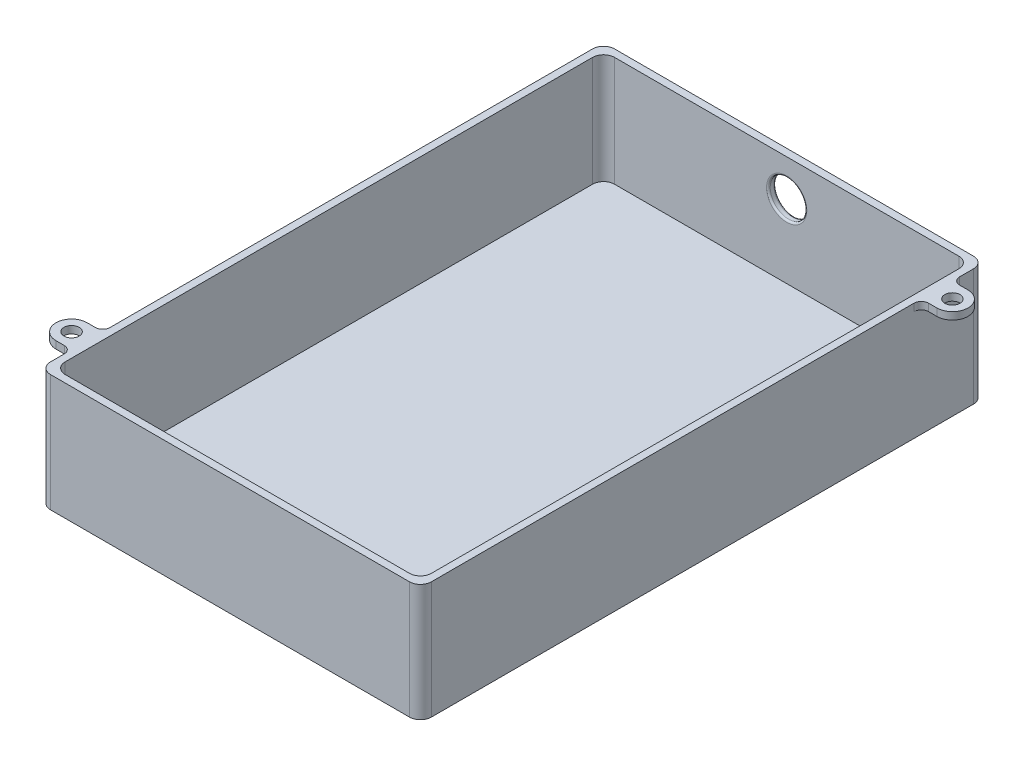
ISO-10303-21;
HEADER;
FILE_DESCRIPTION(('STEP AP214'),'2;1');
FILE_NAME('part.step','',(''),(''),'','','');
FILE_SCHEMA(('AUTOMOTIVE_DESIGN { 1 0 10303 214 1 1 1 1 }'));
ENDSEC;
DATA;
#1=APPLICATION_CONTEXT('core data for automotive mechanical design processes');
#2=APPLICATION_PROTOCOL_DEFINITION('international standard','automotive_design',2000,#1);
#3=PRODUCT_CONTEXT('',#1,'mechanical');
#4=PRODUCT('Part','Part','',(#3));
#5=PRODUCT_RELATED_PRODUCT_CATEGORY('part','',(#4));
#6=PRODUCT_DEFINITION_FORMATION('','',#4);
#7=PRODUCT_DEFINITION_CONTEXT('part definition',#1,'design');
#8=PRODUCT_DEFINITION('design','',#6,#7);
#9=PRODUCT_DEFINITION_SHAPE('','',#8);
#10=(LENGTH_UNIT() NAMED_UNIT(*) SI_UNIT(.MILLI.,.METRE.));
#11=(NAMED_UNIT(*) PLANE_ANGLE_UNIT() SI_UNIT($,.RADIAN.));
#12=(NAMED_UNIT(*) SI_UNIT($,.STERADIAN.) SOLID_ANGLE_UNIT());
#13=UNCERTAINTY_MEASURE_WITH_UNIT(LENGTH_MEASURE(1.E-05),#10,'distance_accuracy_value','');
#14=(GEOMETRIC_REPRESENTATION_CONTEXT(3) GLOBAL_UNCERTAINTY_ASSIGNED_CONTEXT((#13)) GLOBAL_UNIT_ASSIGNED_CONTEXT((#10,
#11,#12)) REPRESENTATION_CONTEXT('',''));
#15=CARTESIAN_POINT('',(0.,0.,0.));
#16=DIRECTION('',(0.,0.,1.));
#17=DIRECTION('',(1.,0.,0.));
#18=AXIS2_PLACEMENT_3D('',#15,#16,#17);
#19=CARTESIAN_POINT('',(-52.,30.,77.));
#20=DIRECTION('',(1.,0.,0.));
#21=DIRECTION('',(0.,0.,-1.));
#22=AXIS2_PLACEMENT_3D('',#19,#20,#21);
#23=PLANE('',#22);
#24=DIRECTION('',(0.,0.,1.));
#25=VECTOR('',#24,1.);
#26=CARTESIAN_POINT('',(-52.,30.,77.));
#27=LINE('',#26,#25);
#28=CARTESIAN_POINT('',(-52.,30.,70.25));
#29=VERTEX_POINT('',#28);
#30=CARTESIAN_POINT('',(-52.,30.,74.));
#31=VERTEX_POINT('',#30);
#32=EDGE_CURVE('E357',#29,#31,#27,.T.);
#33=ORIENTED_EDGE('',*,*,#32,.F.);
#34=DIRECTION('',(0.,1.,0.));
#35=VECTOR('',#34,1.);
#36=CARTESIAN_POINT('',(-52.,30.,70.25));
#37=LINE('',#36,#35);
#38=CARTESIAN_POINT('',(-52.,28.,70.25));
#39=VERTEX_POINT('',#38);
#40=EDGE_CURVE('E518',#29,#39,#37,.F.);
#41=ORIENTED_EDGE('',*,*,#40,.T.);
#42=DIRECTION('',(0.,0.,1.));
#43=VECTOR('',#42,1.);
#44=CARTESIAN_POINT('',(-52.,28.,0.));
#45=LINE('',#44,#43);
#46=CARTESIAN_POINT('',(-52.,28.,57.75));
#47=VERTEX_POINT('',#46);
#48=EDGE_CURVE('E243',#47,#39,#45,.T.);
#49=ORIENTED_EDGE('',*,*,#48,.F.);
#50=DIRECTION('',(0.,1.,0.));
#51=VECTOR('',#50,1.);
#52=CARTESIAN_POINT('',(-52.,30.,57.75));
#53=LINE('',#52,#51);
#54=CARTESIAN_POINT('',(-52.,30.,57.75));
#55=VERTEX_POINT('',#54);
#56=EDGE_CURVE('E514',#47,#55,#53,.T.);
#57=ORIENTED_EDGE('',*,*,#56,.T.);
#58=CARTESIAN_POINT('',(-52.,30.,-74.));
#59=VERTEX_POINT('',#58);
#60=EDGE_CURVE('E372',#59,#55,#27,.T.);
#61=ORIENTED_EDGE('',*,*,#60,.F.);
#62=DIRECTION('',(0.,-1.,0.));
#63=VECTOR('',#62,1.);
#64=CARTESIAN_POINT('',(-52.,30.,-74.));
#65=LINE('',#64,#63);
#66=CARTESIAN_POINT('',(-52.,-2.,-74.));
#67=VERTEX_POINT('',#66);
#68=EDGE_CURVE('E434',#59,#67,#65,.T.);
#69=ORIENTED_EDGE('',*,*,#68,.T.);
#70=DIRECTION('',(0.,0.,-1.));
#71=VECTOR('',#70,1.);
#72=CARTESIAN_POINT('',(-52.,-2.,0.));
#73=LINE('',#72,#71);
#74=CARTESIAN_POINT('',(-52.,-2.,74.));
#75=VERTEX_POINT('',#74);
#76=EDGE_CURVE('E320',#75,#67,#73,.T.);
#77=ORIENTED_EDGE('',*,*,#76,.F.);
#78=DIRECTION('',(0.,-1.,0.));
#79=VECTOR('',#78,1.);
#80=CARTESIAN_POINT('',(-52.,30.,74.));
#81=LINE('',#80,#79);
#82=EDGE_CURVE('E438',#75,#31,#81,.F.);
#83=ORIENTED_EDGE('',*,*,#82,.T.);
#84=EDGE_LOOP('',(#33,#41,#49,#57,#61,#69,#77,#83));
#85=FACE_BOUND('',#84,.T.);
#86=ADVANCED_FACE('F46',(#85),#23,.F.);
#87=CARTESIAN_POINT('',(0.,30.,0.));
#88=DIRECTION('',(0.,-1.,0.));
#89=DIRECTION('',(0.,0.,-1.));
#90=AXIS2_PLACEMENT_3D('',#87,#88,#89);
#91=PLANE('',#90);
#92=DIRECTION('',(0.,0.,-1.));
#93=VECTOR('',#92,1.);
#94=CARTESIAN_POINT('',(52.,30.,77.));
#95=LINE('',#94,#93);
#96=CARTESIAN_POINT('',(52.,30.,74.));
#97=VERTEX_POINT('',#96);
#98=CARTESIAN_POINT('',(52.,30.,-57.75));
#99=VERTEX_POINT('',#98);
#100=EDGE_CURVE('E381',#97,#99,#95,.T.);
#101=ORIENTED_EDGE('',*,*,#100,.T.);
#102=CARTESIAN_POINT('',(54.,30.,-57.75));
#103=DIRECTION('',(0.,-1.,0.));
#104=DIRECTION('',(0.,0.,-1.));
#105=AXIS2_PLACEMENT_3D('',#102,#103,#104);
#106=CIRCLE('',#105,2.);
#107=CARTESIAN_POINT('',(54.,30.,-59.75));
#108=VERTEX_POINT('',#107);
#109=EDGE_CURVE('E55',#99,#108,#106,.T.);
#110=ORIENTED_EDGE('',*,*,#109,.T.);
#111=DIRECTION('',(1.,0.,0.));
#112=VECTOR('',#111,1.);
#113=CARTESIAN_POINT('',(56.25,30.,-59.75));
#114=LINE('',#113,#112);
#115=CARTESIAN_POINT('',(56.25,30.,-59.75));
#116=VERTEX_POINT('',#115);
#117=EDGE_CURVE('E288',#108,#116,#114,.T.);
#118=ORIENTED_EDGE('',*,*,#117,.T.);
#119=CARTESIAN_POINT('',(56.25,30.,-64.));
#120=DIRECTION('',(0.,1.,0.));
#121=DIRECTION('',(0.,0.,1.));
#122=AXIS2_PLACEMENT_3D('',#119,#120,#121);
#123=CIRCLE('',#122,4.25);
#124=CARTESIAN_POINT('',(56.25,30.,-68.25));
#125=VERTEX_POINT('',#124);
#126=EDGE_CURVE('E310',#116,#125,#123,.T.);
#127=ORIENTED_EDGE('',*,*,#126,.T.);
#128=DIRECTION('',(-1.,0.,0.));
#129=VECTOR('',#128,1.);
#130=CARTESIAN_POINT('',(56.25,30.,-68.25));
#131=LINE('',#130,#129);
#132=CARTESIAN_POINT('',(54.,30.,-68.25));
#133=VERTEX_POINT('',#132);
#134=EDGE_CURVE('E296',#125,#133,#131,.T.);
#135=ORIENTED_EDGE('',*,*,#134,.T.);
#136=CARTESIAN_POINT('',(54.,30.,-70.25));
#137=DIRECTION('',(0.,-1.,0.));
#138=DIRECTION('',(0.,0.,-1.));
#139=AXIS2_PLACEMENT_3D('',#136,#137,#138);
#140=CIRCLE('',#139,2.);
#141=CARTESIAN_POINT('',(52.,30.,-70.25));
#142=VERTEX_POINT('',#141);
#143=EDGE_CURVE('E550',#133,#142,#140,.T.);
#144=ORIENTED_EDGE('',*,*,#143,.T.);
#145=CARTESIAN_POINT('',(52.,30.,-74.));
#146=VERTEX_POINT('',#145);
#147=EDGE_CURVE('E380',#142,#146,#95,.T.);
#148=ORIENTED_EDGE('',*,*,#147,.T.);
#149=CARTESIAN_POINT('',(49.,30.,-74.));
#150=DIRECTION('',(0.,-1.,0.));
#151=DIRECTION('',(0.,0.,-1.));
#152=AXIS2_PLACEMENT_3D('',#149,#150,#151);
#153=CIRCLE('',#152,3.);
#154=CARTESIAN_POINT('',(49.,30.,-77.));
#155=VERTEX_POINT('',#154);
#156=EDGE_CURVE('E424',#146,#155,#153,.F.);
#157=ORIENTED_EDGE('',*,*,#156,.T.);
#158=DIRECTION('',(-1.,0.,0.));
#159=VECTOR('',#158,1.);
#160=CARTESIAN_POINT('',(-52.,30.,-77.));
#161=LINE('',#160,#159);
#162=CARTESIAN_POINT('',(-49.,30.,-77.));
#163=VERTEX_POINT('',#162);
#164=EDGE_CURVE('E384',#155,#163,#161,.T.);
#165=ORIENTED_EDGE('',*,*,#164,.T.);
#166=CARTESIAN_POINT('',(-49.,30.,-74.));
#167=DIRECTION('',(0.,-1.,0.));
#168=DIRECTION('',(0.,0.,-1.));
#169=AXIS2_PLACEMENT_3D('',#166,#167,#168);
#170=CIRCLE('',#169,3.);
#171=EDGE_CURVE('E415',#163,#59,#170,.F.);
#172=ORIENTED_EDGE('',*,*,#171,.T.);
#173=ORIENTED_EDGE('',*,*,#60,.T.);
#174=CARTESIAN_POINT('',(-54.,30.,57.75));
#175=DIRECTION('',(0.,-1.,0.));
#176=DIRECTION('',(0.,0.,-1.));
#177=AXIS2_PLACEMENT_3D('',#174,#175,#176);
#178=CIRCLE('',#177,2.);
#179=CARTESIAN_POINT('',(-54.,30.,59.75));
#180=VERTEX_POINT('',#179);
#181=EDGE_CURVE('E544',#55,#180,#178,.T.);
#182=ORIENTED_EDGE('',*,*,#181,.T.);
#183=DIRECTION('',(1.,0.,0.));
#184=VECTOR('',#183,1.);
#185=CARTESIAN_POINT('',(0.,30.,59.7500000000001));
#186=LINE('',#185,#184);
#187=CARTESIAN_POINT('',(-56.25,30.,59.75));
#188=VERTEX_POINT('',#187);
#189=EDGE_CURVE('E272',#188,#180,#186,.T.);
#190=ORIENTED_EDGE('',*,*,#189,.F.);
#191=CARTESIAN_POINT('',(-56.25,30.,64.));
#192=DIRECTION('',(0.,1.,0.));
#193=DIRECTION('',(0.,0.,1.));
#194=AXIS2_PLACEMENT_3D('',#191,#192,#193);
#195=CIRCLE('',#194,4.25);
#196=CARTESIAN_POINT('',(-56.25,30.,68.25));
#197=VERTEX_POINT('',#196);
#198=EDGE_CURVE('E237',#188,#197,#195,.T.);
#199=ORIENTED_EDGE('',*,*,#198,.T.);
#200=DIRECTION('',(1.,0.,0.));
#201=VECTOR('',#200,1.);
#202=CARTESIAN_POINT('',(-2.22860945384315E-13,30.,68.2500000000002));
#203=LINE('',#202,#201);
#204=CARTESIAN_POINT('',(-54.,30.,68.25));
#205=VERTEX_POINT('',#204);
#206=EDGE_CURVE('E277',#197,#205,#203,.T.);
#207=ORIENTED_EDGE('',*,*,#206,.T.);
#208=CARTESIAN_POINT('',(-54.,30.,70.25));
#209=DIRECTION('',(0.,-1.,0.));
#210=DIRECTION('',(0.,0.,-1.));
#211=AXIS2_PLACEMENT_3D('',#208,#209,#210);
#212=CIRCLE('',#211,2.);
#213=EDGE_CURVE('E538',#205,#29,#212,.T.);
#214=ORIENTED_EDGE('',*,*,#213,.T.);
#215=ORIENTED_EDGE('',*,*,#32,.T.);
#216=CARTESIAN_POINT('',(-49.,30.,74.));
#217=DIRECTION('',(0.,-1.,0.));
#218=DIRECTION('',(0.,0.,-1.));
#219=AXIS2_PLACEMENT_3D('',#216,#217,#218);
#220=CIRCLE('',#219,3.);
#221=CARTESIAN_POINT('',(-49.,30.,77.));
#222=VERTEX_POINT('',#221);
#223=EDGE_CURVE('E418',#31,#222,#220,.F.);
#224=ORIENTED_EDGE('',*,*,#223,.T.);
#225=DIRECTION('',(1.,0.,0.));
#226=VECTOR('',#225,1.);
#227=CARTESIAN_POINT('',(-52.,30.,77.));
#228=LINE('',#227,#226);
#229=CARTESIAN_POINT('',(49.,30.,77.));
#230=VERTEX_POINT('',#229);
#231=EDGE_CURVE('E376',#222,#230,#228,.T.);
#232=ORIENTED_EDGE('',*,*,#231,.T.);
#233=CARTESIAN_POINT('',(49.,30.,74.));
#234=DIRECTION('',(0.,-1.,0.));
#235=DIRECTION('',(0.,0.,-1.));
#236=AXIS2_PLACEMENT_3D('',#233,#234,#235);
#237=CIRCLE('',#236,3.);
#238=EDGE_CURVE('E421',#230,#97,#237,.F.);
#239=ORIENTED_EDGE('',*,*,#238,.T.);
#240=EDGE_LOOP('',(#101,#110,#118,#127,#135,#144,#148,#157,#165,#172,#173,#182,#190,#199,#207,
#214,#215,#224,#232,#239));
#241=FACE_BOUND('',#240,.T.);
#242=DIRECTION('',(0.,0.,-1.));
#243=VECTOR('',#242,1.);
#244=CARTESIAN_POINT('',(50.,30.,75.));
#245=LINE('',#244,#243);
#246=CARTESIAN_POINT('',(50.,30.,72.));
#247=VERTEX_POINT('',#246);
#248=CARTESIAN_POINT('',(50.,30.,-72.));
#249=VERTEX_POINT('',#248);
#250=EDGE_CURVE('E340',#247,#249,#245,.T.);
#251=ORIENTED_EDGE('',*,*,#250,.F.);
#252=CARTESIAN_POINT('',(47.,30.,72.));
#253=DIRECTION('',(0.,-1.,0.));
#254=DIRECTION('',(0.,0.,-1.));
#255=AXIS2_PLACEMENT_3D('',#252,#253,#254);
#256=CIRCLE('',#255,3.);
#257=CARTESIAN_POINT('',(47.,30.,75.));
#258=VERTEX_POINT('',#257);
#259=EDGE_CURVE('E491',#247,#258,#256,.T.);
#260=ORIENTED_EDGE('',*,*,#259,.T.);
#261=DIRECTION('',(1.,0.,0.));
#262=VECTOR('',#261,1.);
#263=CARTESIAN_POINT('',(-50.,30.,75.));
#264=LINE('',#263,#262);
#265=CARTESIAN_POINT('',(-47.,30.,75.));
#266=VERTEX_POINT('',#265);
#267=EDGE_CURVE('E353',#266,#258,#264,.T.);
#268=ORIENTED_EDGE('',*,*,#267,.F.);
#269=CARTESIAN_POINT('',(-47.,30.,72.));
#270=DIRECTION('',(0.,-1.,0.));
#271=DIRECTION('',(0.,0.,-1.));
#272=AXIS2_PLACEMENT_3D('',#269,#270,#271);
#273=CIRCLE('',#272,3.);
#274=CARTESIAN_POINT('',(-50.,30.,72.));
#275=VERTEX_POINT('',#274);
#276=EDGE_CURVE('E482',#266,#275,#273,.T.);
#277=ORIENTED_EDGE('',*,*,#276,.T.);
#278=DIRECTION('',(0.,0.,1.));
#279=VECTOR('',#278,1.);
#280=CARTESIAN_POINT('',(-50.,30.,75.));
#281=LINE('',#280,#279);
#282=CARTESIAN_POINT('',(-50.,30.,-72.));
#283=VERTEX_POINT('',#282);
#284=EDGE_CURVE('E349',#283,#275,#281,.T.);
#285=ORIENTED_EDGE('',*,*,#284,.F.);
#286=CARTESIAN_POINT('',(-47.,30.,-72.));
#287=DIRECTION('',(0.,-1.,0.));
#288=DIRECTION('',(0.,0.,-1.));
#289=AXIS2_PLACEMENT_3D('',#286,#287,#288);
#290=CIRCLE('',#289,3.);
#291=CARTESIAN_POINT('',(-47.,30.,-75.));
#292=VERTEX_POINT('',#291);
#293=EDGE_CURVE('E485',#283,#292,#290,.T.);
#294=ORIENTED_EDGE('',*,*,#293,.T.);
#295=DIRECTION('',(-1.,0.,0.));
#296=VECTOR('',#295,1.);
#297=CARTESIAN_POINT('',(-50.,30.,-75.));
#298=LINE('',#297,#296);
#299=CARTESIAN_POINT('',(47.,30.,-75.));
#300=VERTEX_POINT('',#299);
#301=EDGE_CURVE('E344',#300,#292,#298,.T.);
#302=ORIENTED_EDGE('',*,*,#301,.F.);
#303=CARTESIAN_POINT('',(47.,30.,-72.));
#304=DIRECTION('',(0.,-1.,0.));
#305=DIRECTION('',(0.,0.,-1.));
#306=AXIS2_PLACEMENT_3D('',#303,#304,#305);
#307=CIRCLE('',#306,3.);
#308=EDGE_CURVE('E488',#300,#249,#307,.T.);
#309=ORIENTED_EDGE('',*,*,#308,.T.);
#310=EDGE_LOOP('',(#251,#260,#268,#277,#285,#294,#302,#309));
#311=FACE_BOUND('',#310,.T.);
#312=CARTESIAN_POINT('',(56.25,30.,-64.));
#313=DIRECTION('',(0.,1.,0.));
#314=DIRECTION('',(0.,0.,1.));
#315=AXIS2_PLACEMENT_3D('',#312,#313,#314);
#316=CIRCLE('',#315,2.075);
#317=CARTESIAN_POINT('',(56.25,30.,-61.925));
#318=VERTEX_POINT('',#317);
#319=EDGE_CURVE('E282',#318,#318,#316,.T.);
#320=ORIENTED_EDGE('',*,*,#319,.F.);
#321=EDGE_LOOP('',(#320));
#322=FACE_BOUND('',#321,.T.);
#323=CARTESIAN_POINT('',(-56.25,30.,64.));
#324=DIRECTION('',(0.,1.,0.));
#325=DIRECTION('',(0.,0.,1.));
#326=AXIS2_PLACEMENT_3D('',#323,#324,#325);
#327=CIRCLE('',#326,2.075);
#328=CARTESIAN_POINT('',(-56.25,30.,66.075));
#329=VERTEX_POINT('',#328);
#330=EDGE_CURVE('E268',#329,#329,#327,.T.);
#331=ORIENTED_EDGE('',*,*,#330,.F.);
#332=EDGE_LOOP('',(#331));
#333=FACE_BOUND('',#332,.T.);
#334=ADVANCED_FACE('F559',(#241,#311,#322,#333),#91,.F.);
#335=CARTESIAN_POINT('',(-52.,30.,77.));
#336=DIRECTION('',(0.,0.,-1.));
#337=DIRECTION('',(-1.,0.,0.));
#338=AXIS2_PLACEMENT_3D('',#335,#336,#337);
#339=PLANE('',#338);
#340=DIRECTION('',(1.,0.,0.));
#341=VECTOR('',#340,1.);
#342=CARTESIAN_POINT('',(0.,-2.,77.));
#343=LINE('',#342,#341);
#344=CARTESIAN_POINT('',(-49.,-2.,77.));
#345=VERTEX_POINT('',#344);
#346=CARTESIAN_POINT('',(49.,-2.,77.));
#347=VERTEX_POINT('',#346);
#348=EDGE_CURVE('E327',#345,#347,#343,.T.);
#349=ORIENTED_EDGE('',*,*,#348,.T.);
#350=DIRECTION('',(0.,-1.,0.));
#351=VECTOR('',#350,1.);
#352=CARTESIAN_POINT('',(49.,30.,77.));
#353=LINE('',#352,#351);
#354=EDGE_CURVE('E431',#347,#230,#353,.F.);
#355=ORIENTED_EDGE('',*,*,#354,.T.);
#356=ORIENTED_EDGE('',*,*,#231,.F.);
#357=DIRECTION('',(0.,-1.,0.));
#358=VECTOR('',#357,1.);
#359=CARTESIAN_POINT('',(-49.,30.,77.));
#360=LINE('',#359,#358);
#361=EDGE_CURVE('E427',#222,#345,#360,.T.);
#362=ORIENTED_EDGE('',*,*,#361,.T.);
#363=EDGE_LOOP('',(#349,#355,#356,#362));
#364=FACE_BOUND('',#363,.T.);
#365=ADVANCED_FACE('F572',(#364),#339,.F.);
#366=CARTESIAN_POINT('',(52.,30.,77.));
#367=DIRECTION('',(-1.,0.,0.));
#368=DIRECTION('',(0.,0.,1.));
#369=AXIS2_PLACEMENT_3D('',#366,#367,#368);
#370=PLANE('',#369);
#371=ORIENTED_EDGE('',*,*,#147,.F.);
#372=DIRECTION('',(0.,1.,0.));
#373=VECTOR('',#372,1.);
#374=CARTESIAN_POINT('',(52.,30.,-70.25));
#375=LINE('',#374,#373);
#376=CARTESIAN_POINT('',(52.,28.,-70.25));
#377=VERTEX_POINT('',#376);
#378=EDGE_CURVE('E532',#142,#377,#375,.F.);
#379=ORIENTED_EDGE('',*,*,#378,.T.);
#380=DIRECTION('',(0.,0.,1.));
#381=VECTOR('',#380,1.);
#382=CARTESIAN_POINT('',(52.,28.,-59.75));
#383=LINE('',#382,#381);
#384=CARTESIAN_POINT('',(52.,28.,-57.75));
#385=VERTEX_POINT('',#384);
#386=EDGE_CURVE('E292',#377,#385,#383,.T.);
#387=ORIENTED_EDGE('',*,*,#386,.T.);
#388=DIRECTION('',(0.,1.,0.));
#389=VECTOR('',#388,1.);
#390=CARTESIAN_POINT('',(52.,30.,-57.75));
#391=LINE('',#390,#389);
#392=EDGE_CURVE('E528',#385,#99,#391,.T.);
#393=ORIENTED_EDGE('',*,*,#392,.T.);
#394=ORIENTED_EDGE('',*,*,#100,.F.);
#395=DIRECTION('',(0.,-1.,0.));
#396=VECTOR('',#395,1.);
#397=CARTESIAN_POINT('',(52.,30.,74.));
#398=LINE('',#397,#396);
#399=CARTESIAN_POINT('',(52.,-2.,74.));
#400=VERTEX_POINT('',#399);
#401=EDGE_CURVE('E407',#97,#400,#398,.T.);
#402=ORIENTED_EDGE('',*,*,#401,.T.);
#403=DIRECTION('',(0.,0.,-1.));
#404=VECTOR('',#403,1.);
#405=CARTESIAN_POINT('',(52.,-2.,0.));
#406=LINE('',#405,#404);
#407=CARTESIAN_POINT('',(52.,-2.,-74.));
#408=VERTEX_POINT('',#407);
#409=EDGE_CURVE('E331',#400,#408,#406,.T.);
#410=ORIENTED_EDGE('',*,*,#409,.T.);
#411=DIRECTION('',(0.,-1.,0.));
#412=VECTOR('',#411,1.);
#413=CARTESIAN_POINT('',(52.,30.,-74.));
#414=LINE('',#413,#412);
#415=EDGE_CURVE('E411',#408,#146,#414,.F.);
#416=ORIENTED_EDGE('',*,*,#415,.T.);
#417=EDGE_LOOP('',(#371,#379,#387,#393,#394,#402,#410,#416));
#418=FACE_BOUND('',#417,.T.);
#419=ADVANCED_FACE('F584',(#418),#370,.F.);
#420=CARTESIAN_POINT('',(-52.,30.,-77.));
#421=DIRECTION('',(0.,0.,1.));
#422=DIRECTION('',(1.,0.,0.));
#423=AXIS2_PLACEMENT_3D('',#420,#421,#422);
#424=PLANE('',#423);
#425=CARTESIAN_POINT('',(0.,20.,-77.));
#426=DIRECTION('',(0.,0.,1.));
#427=DIRECTION('',(1.,0.,0.));
#428=AXIS2_PLACEMENT_3D('',#425,#426,#427);
#429=CIRCLE('',#428,5.5);
#430=CARTESIAN_POINT('',(5.5,20.,-77.));
#431=VERTEX_POINT('',#430);
#432=EDGE_CURVE('E506',#431,#431,#429,.T.);
#433=ORIENTED_EDGE('',*,*,#432,.T.);
#434=EDGE_LOOP('',(#433));
#435=FACE_BOUND('',#434,.T.);
#436=ORIENTED_EDGE('',*,*,#164,.F.);
#437=DIRECTION('',(0.,-1.,0.));
#438=VECTOR('',#437,1.);
#439=CARTESIAN_POINT('',(49.,30.,-77.));
#440=LINE('',#439,#438);
#441=CARTESIAN_POINT('',(49.,-2.,-77.));
#442=VERTEX_POINT('',#441);
#443=EDGE_CURVE('E391',#155,#442,#440,.T.);
#444=ORIENTED_EDGE('',*,*,#443,.T.);
#445=DIRECTION('',(1.,0.,0.));
#446=VECTOR('',#445,1.);
#447=CARTESIAN_POINT('',(0.,-2.,-77.));
#448=LINE('',#447,#446);
#449=CARTESIAN_POINT('',(-49.,-2.,-77.));
#450=VERTEX_POINT('',#449);
#451=EDGE_CURVE('E335',#450,#442,#448,.T.);
#452=ORIENTED_EDGE('',*,*,#451,.F.);
#453=DIRECTION('',(0.,-1.,0.));
#454=VECTOR('',#453,1.);
#455=CARTESIAN_POINT('',(-49.,30.,-77.));
#456=LINE('',#455,#454);
#457=EDGE_CURVE('E388',#450,#163,#456,.F.);
#458=ORIENTED_EDGE('',*,*,#457,.T.);
#459=EDGE_LOOP('',(#436,#444,#452,#458));
#460=FACE_BOUND('',#459,.T.);
#461=ADVANCED_FACE('F613',(#435,#460),#424,.F.);
#462=CARTESIAN_POINT('',(50.,30.,75.));
#463=DIRECTION('',(-1.,0.,0.));
#464=DIRECTION('',(0.,0.,1.));
#465=AXIS2_PLACEMENT_3D('',#462,#463,#464);
#466=PLANE('',#465);
#467=ORIENTED_EDGE('',*,*,#250,.T.);
#468=DIRECTION('',(0.,-1.,0.));
#469=VECTOR('',#468,1.);
#470=CARTESIAN_POINT('',(50.,0.,-72.));
#471=LINE('',#470,#469);
#472=CARTESIAN_POINT('',(50.,0.,-72.));
#473=VERTEX_POINT('',#472);
#474=EDGE_CURVE('E478',#249,#473,#471,.T.);
#475=ORIENTED_EDGE('',*,*,#474,.T.);
#476=DIRECTION('',(0.,0.,-1.));
#477=VECTOR('',#476,1.);
#478=CARTESIAN_POINT('',(50.,0.,75.));
#479=LINE('',#478,#477);
#480=CARTESIAN_POINT('',(50.,0.,72.));
#481=VERTEX_POINT('',#480);
#482=EDGE_CURVE('E339',#481,#473,#479,.T.);
#483=ORIENTED_EDGE('',*,*,#482,.F.);
#484=DIRECTION('',(0.,-1.,0.));
#485=VECTOR('',#484,1.);
#486=CARTESIAN_POINT('',(50.,30.,72.));
#487=LINE('',#486,#485);
#488=EDGE_CURVE('E475',#481,#247,#487,.F.);
#489=ORIENTED_EDGE('',*,*,#488,.T.);
#490=EDGE_LOOP('',(#467,#475,#483,#489));
#491=FACE_BOUND('',#490,.T.);
#492=ADVANCED_FACE('F694',(#491),#466,.T.);
#493=CARTESIAN_POINT('',(-50.,30.,-75.));
#494=DIRECTION('',(0.,0.,1.));
#495=DIRECTION('',(1.,0.,0.));
#496=AXIS2_PLACEMENT_3D('',#493,#494,#495);
#497=PLANE('',#496);
#498=CARTESIAN_POINT('',(0.,20.,-75.));
#499=DIRECTION('',(0.,0.,1.));
#500=DIRECTION('',(1.,0.,0.));
#501=AXIS2_PLACEMENT_3D('',#498,#499,#500);
#502=CIRCLE('',#501,5.5);
#503=CARTESIAN_POINT('',(5.5,20.,-75.));
#504=VERTEX_POINT('',#503);
#505=EDGE_CURVE('E502',#504,#504,#502,.F.);
#506=ORIENTED_EDGE('',*,*,#505,.T.);
#507=EDGE_LOOP('',(#506));
#508=FACE_BOUND('',#507,.T.);
#509=ORIENTED_EDGE('',*,*,#301,.T.);
#510=DIRECTION('',(0.,-1.,0.));
#511=VECTOR('',#510,1.);
#512=CARTESIAN_POINT('',(-47.,0.,-75.));
#513=LINE('',#512,#511);
#514=CARTESIAN_POINT('',(-47.,0.,-75.));
#515=VERTEX_POINT('',#514);
#516=EDGE_CURVE('E471',#292,#515,#513,.T.);
#517=ORIENTED_EDGE('',*,*,#516,.T.);
#518=DIRECTION('',(-1.,0.,0.));
#519=VECTOR('',#518,1.);
#520=CARTESIAN_POINT('',(-50.,0.,-75.));
#521=LINE('',#520,#519);
#522=CARTESIAN_POINT('',(47.,0.,-75.));
#523=VERTEX_POINT('',#522);
#524=EDGE_CURVE('E361',#523,#515,#521,.T.);
#525=ORIENTED_EDGE('',*,*,#524,.F.);
#526=DIRECTION('',(0.,-1.,0.));
#527=VECTOR('',#526,1.);
#528=CARTESIAN_POINT('',(47.,30.,-75.));
#529=LINE('',#528,#527);
#530=EDGE_CURVE('E468',#523,#300,#529,.F.);
#531=ORIENTED_EDGE('',*,*,#530,.T.);
#532=EDGE_LOOP('',(#509,#517,#525,#531));
#533=FACE_BOUND('',#532,.T.);
#534=ADVANCED_FACE('F690',(#508,#533),#497,.T.);
#535=CARTESIAN_POINT('',(-50.,30.,75.));
#536=DIRECTION('',(1.,0.,0.));
#537=DIRECTION('',(0.,0.,-1.));
#538=AXIS2_PLACEMENT_3D('',#535,#536,#537);
#539=PLANE('',#538);
#540=ORIENTED_EDGE('',*,*,#284,.T.);
#541=DIRECTION('',(0.,-1.,0.));
#542=VECTOR('',#541,1.);
#543=CARTESIAN_POINT('',(-50.,0.,72.));
#544=LINE('',#543,#542);
#545=CARTESIAN_POINT('',(-50.,0.,72.));
#546=VERTEX_POINT('',#545);
#547=EDGE_CURVE('E445',#275,#546,#544,.T.);
#548=ORIENTED_EDGE('',*,*,#547,.T.);
#549=DIRECTION('',(0.,0.,1.));
#550=VECTOR('',#549,1.);
#551=CARTESIAN_POINT('',(-50.,0.,75.));
#552=LINE('',#551,#550);
#553=CARTESIAN_POINT('',(-50.,0.,-72.));
#554=VERTEX_POINT('',#553);
#555=EDGE_CURVE('E365',#554,#546,#552,.T.);
#556=ORIENTED_EDGE('',*,*,#555,.F.);
#557=DIRECTION('',(0.,-1.,0.));
#558=VECTOR('',#557,1.);
#559=CARTESIAN_POINT('',(-50.,30.,-72.));
#560=LINE('',#559,#558);
#561=EDGE_CURVE('E442',#554,#283,#560,.F.);
#562=ORIENTED_EDGE('',*,*,#561,.T.);
#563=EDGE_LOOP('',(#540,#548,#556,#562));
#564=FACE_BOUND('',#563,.T.);
#565=ADVANCED_FACE('F693',(#564),#539,.T.);
#566=CARTESIAN_POINT('',(-50.,30.,75.));
#567=DIRECTION('',(0.,0.,-1.));
#568=DIRECTION('',(-1.,0.,0.));
#569=AXIS2_PLACEMENT_3D('',#566,#567,#568);
#570=PLANE('',#569);
#571=DIRECTION('',(1.,0.,0.));
#572=VECTOR('',#571,1.);
#573=CARTESIAN_POINT('',(-50.,0.,75.));
#574=LINE('',#573,#572);
#575=CARTESIAN_POINT('',(-47.,0.,75.));
#576=VERTEX_POINT('',#575);
#577=CARTESIAN_POINT('',(47.,0.,75.));
#578=VERTEX_POINT('',#577);
#579=EDGE_CURVE('E345',#576,#578,#574,.T.);
#580=ORIENTED_EDGE('',*,*,#579,.F.);
#581=DIRECTION('',(0.,-1.,0.));
#582=VECTOR('',#581,1.);
#583=CARTESIAN_POINT('',(-47.,30.,75.));
#584=LINE('',#583,#582);
#585=EDGE_CURVE('E465',#576,#266,#584,.F.);
#586=ORIENTED_EDGE('',*,*,#585,.T.);
#587=ORIENTED_EDGE('',*,*,#267,.T.);
#588=DIRECTION('',(0.,-1.,0.));
#589=VECTOR('',#588,1.);
#590=CARTESIAN_POINT('',(47.,0.,75.));
#591=LINE('',#590,#589);
#592=EDGE_CURVE('E461',#258,#578,#591,.T.);
#593=ORIENTED_EDGE('',*,*,#592,.T.);
#594=EDGE_LOOP('',(#580,#586,#587,#593));
#595=FACE_BOUND('',#594,.T.);
#596=ADVANCED_FACE('F713',(#595),#570,.T.);
#597=CARTESIAN_POINT('',(0.,0.,0.));
#598=DIRECTION('',(0.,1.,0.));
#599=DIRECTION('',(0.,0.,1.));
#600=AXIS2_PLACEMENT_3D('',#597,#598,#599);
#601=PLANE('',#600);
#602=ORIENTED_EDGE('',*,*,#555,.T.);
#603=CARTESIAN_POINT('',(-47.,0.,72.));
#604=DIRECTION('',(0.,1.,0.));
#605=DIRECTION('',(0.,0.,1.));
#606=AXIS2_PLACEMENT_3D('',#603,#604,#605);
#607=CIRCLE('',#606,3.);
#608=EDGE_CURVE('E458',#546,#576,#607,.T.);
#609=ORIENTED_EDGE('',*,*,#608,.T.);
#610=ORIENTED_EDGE('',*,*,#579,.T.);
#611=CARTESIAN_POINT('',(47.,0.,72.));
#612=DIRECTION('',(0.,1.,0.));
#613=DIRECTION('',(0.,0.,1.));
#614=AXIS2_PLACEMENT_3D('',#611,#612,#613);
#615=CIRCLE('',#614,3.);
#616=EDGE_CURVE('E449',#578,#481,#615,.T.);
#617=ORIENTED_EDGE('',*,*,#616,.T.);
#618=ORIENTED_EDGE('',*,*,#482,.T.);
#619=CARTESIAN_POINT('',(47.,0.,-72.));
#620=DIRECTION('',(0.,1.,0.));
#621=DIRECTION('',(0.,0.,1.));
#622=AXIS2_PLACEMENT_3D('',#619,#620,#621);
#623=CIRCLE('',#622,3.);
#624=EDGE_CURVE('E452',#473,#523,#623,.T.);
#625=ORIENTED_EDGE('',*,*,#624,.T.);
#626=ORIENTED_EDGE('',*,*,#524,.T.);
#627=CARTESIAN_POINT('',(-47.,0.,-72.));
#628=DIRECTION('',(0.,1.,0.));
#629=DIRECTION('',(0.,0.,1.));
#630=AXIS2_PLACEMENT_3D('',#627,#628,#629);
#631=CIRCLE('',#630,3.);
#632=EDGE_CURVE('E455',#515,#554,#631,.T.);
#633=ORIENTED_EDGE('',*,*,#632,.T.);
#634=EDGE_LOOP('',(#602,#609,#610,#617,#618,#625,#626,#633));
#635=FACE_BOUND('',#634,.T.);
#636=ADVANCED_FACE('F705',(#635),#601,.T.);
#637=CARTESIAN_POINT('',(0.,-2.,0.));
#638=DIRECTION('',(0.,1.,0.));
#639=DIRECTION('',(0.,0.,1.));
#640=AXIS2_PLACEMENT_3D('',#637,#638,#639);
#641=PLANE('',#640);
#642=ORIENTED_EDGE('',*,*,#451,.T.);
#643=CARTESIAN_POINT('',(49.,-2.,-74.));
#644=DIRECTION('',(0.,1.,0.));
#645=DIRECTION('',(0.,0.,1.));
#646=AXIS2_PLACEMENT_3D('',#643,#644,#645);
#647=CIRCLE('',#646,3.);
#648=EDGE_CURVE('E404',#442,#408,#647,.F.);
#649=ORIENTED_EDGE('',*,*,#648,.T.);
#650=ORIENTED_EDGE('',*,*,#409,.F.);
#651=CARTESIAN_POINT('',(49.,-2.,74.));
#652=DIRECTION('',(0.,1.,0.));
#653=DIRECTION('',(0.,0.,1.));
#654=AXIS2_PLACEMENT_3D('',#651,#652,#653);
#655=CIRCLE('',#654,3.);
#656=EDGE_CURVE('E401',#400,#347,#655,.F.);
#657=ORIENTED_EDGE('',*,*,#656,.T.);
#658=ORIENTED_EDGE('',*,*,#348,.F.);
#659=CARTESIAN_POINT('',(-49.,-2.,74.));
#660=DIRECTION('',(0.,1.,0.));
#661=DIRECTION('',(0.,0.,1.));
#662=AXIS2_PLACEMENT_3D('',#659,#660,#661);
#663=CIRCLE('',#662,3.);
#664=EDGE_CURVE('E398',#345,#75,#663,.F.);
#665=ORIENTED_EDGE('',*,*,#664,.T.);
#666=ORIENTED_EDGE('',*,*,#76,.T.);
#667=CARTESIAN_POINT('',(-49.,-2.,-74.));
#668=DIRECTION('',(0.,1.,0.));
#669=DIRECTION('',(0.,0.,1.));
#670=AXIS2_PLACEMENT_3D('',#667,#668,#669);
#671=CIRCLE('',#670,3.);
#672=EDGE_CURVE('E395',#67,#450,#671,.F.);
#673=ORIENTED_EDGE('',*,*,#672,.T.);
#674=EDGE_LOOP('',(#642,#649,#650,#657,#658,#665,#666,#673));
#675=FACE_BOUND('',#674,.T.);
#676=ADVANCED_FACE('F575',(#675),#641,.F.);
#677=CARTESIAN_POINT('',(49.,30.,-74.));
#678=DIRECTION('',(0.,-1.,0.));
#679=DIRECTION('',(0.,0.,-1.));
#680=AXIS2_PLACEMENT_3D('',#677,#678,#679);
#681=CYLINDRICAL_SURFACE('',#680,3.);
#682=ORIENTED_EDGE('',*,*,#156,.F.);
#683=ORIENTED_EDGE('',*,*,#415,.F.);
#684=ORIENTED_EDGE('',*,*,#648,.F.);
#685=ORIENTED_EDGE('',*,*,#443,.F.);
#686=EDGE_LOOP('',(#682,#683,#684,#685));
#687=FACE_BOUND('',#686,.T.);
#688=ADVANCED_FACE('F609',(#687),#681,.T.);
#689=CARTESIAN_POINT('',(49.,30.,74.));
#690=DIRECTION('',(0.,-1.,0.));
#691=DIRECTION('',(0.,0.,-1.));
#692=AXIS2_PLACEMENT_3D('',#689,#690,#691);
#693=CYLINDRICAL_SURFACE('',#692,3.);
#694=ORIENTED_EDGE('',*,*,#238,.F.);
#695=ORIENTED_EDGE('',*,*,#354,.F.);
#696=ORIENTED_EDGE('',*,*,#656,.F.);
#697=ORIENTED_EDGE('',*,*,#401,.F.);
#698=EDGE_LOOP('',(#694,#695,#696,#697));
#699=FACE_BOUND('',#698,.T.);
#700=ADVANCED_FACE('F580',(#699),#693,.T.);
#701=CARTESIAN_POINT('',(-49.,30.,74.));
#702=DIRECTION('',(0.,-1.,0.));
#703=DIRECTION('',(0.,0.,-1.));
#704=AXIS2_PLACEMENT_3D('',#701,#702,#703);
#705=CYLINDRICAL_SURFACE('',#704,3.);
#706=ORIENTED_EDGE('',*,*,#223,.F.);
#707=ORIENTED_EDGE('',*,*,#82,.F.);
#708=ORIENTED_EDGE('',*,*,#664,.F.);
#709=ORIENTED_EDGE('',*,*,#361,.F.);
#710=EDGE_LOOP('',(#706,#707,#708,#709));
#711=FACE_BOUND('',#710,.T.);
#712=ADVANCED_FACE('F569',(#711),#705,.T.);
#713=CARTESIAN_POINT('',(-49.,30.,-74.));
#714=DIRECTION('',(0.,-1.,0.));
#715=DIRECTION('',(0.,0.,-1.));
#716=AXIS2_PLACEMENT_3D('',#713,#714,#715);
#717=CYLINDRICAL_SURFACE('',#716,3.);
#718=ORIENTED_EDGE('',*,*,#171,.F.);
#719=ORIENTED_EDGE('',*,*,#457,.F.);
#720=ORIENTED_EDGE('',*,*,#672,.F.);
#721=ORIENTED_EDGE('',*,*,#68,.F.);
#722=EDGE_LOOP('',(#718,#719,#720,#721));
#723=FACE_BOUND('',#722,.T.);
#724=ADVANCED_FACE('F617',(#723),#717,.T.);
#725=CARTESIAN_POINT('',(-47.,30.,72.));
#726=DIRECTION('',(0.,1.,0.));
#727=DIRECTION('',(0.,0.,1.));
#728=AXIS2_PLACEMENT_3D('',#725,#726,#727);
#729=CYLINDRICAL_SURFACE('',#728,3.);
#730=ORIENTED_EDGE('',*,*,#276,.F.);
#731=ORIENTED_EDGE('',*,*,#585,.F.);
#732=ORIENTED_EDGE('',*,*,#608,.F.);
#733=ORIENTED_EDGE('',*,*,#547,.F.);
#734=EDGE_LOOP('',(#730,#731,#732,#733));
#735=FACE_BOUND('',#734,.T.);
#736=ADVANCED_FACE('F659',(#735),#729,.F.);
#737=CARTESIAN_POINT('',(-47.,30.,-72.));
#738=DIRECTION('',(0.,1.,0.));
#739=DIRECTION('',(0.,0.,1.));
#740=AXIS2_PLACEMENT_3D('',#737,#738,#739);
#741=CYLINDRICAL_SURFACE('',#740,3.);
#742=ORIENTED_EDGE('',*,*,#293,.F.);
#743=ORIENTED_EDGE('',*,*,#561,.F.);
#744=ORIENTED_EDGE('',*,*,#632,.F.);
#745=ORIENTED_EDGE('',*,*,#516,.F.);
#746=EDGE_LOOP('',(#742,#743,#744,#745));
#747=FACE_BOUND('',#746,.T.);
#748=ADVANCED_FACE('F662',(#747),#741,.F.);
#749=CARTESIAN_POINT('',(47.,30.,-72.));
#750=DIRECTION('',(0.,1.,0.));
#751=DIRECTION('',(0.,0.,1.));
#752=AXIS2_PLACEMENT_3D('',#749,#750,#751);
#753=CYLINDRICAL_SURFACE('',#752,3.);
#754=ORIENTED_EDGE('',*,*,#308,.F.);
#755=ORIENTED_EDGE('',*,*,#530,.F.);
#756=ORIENTED_EDGE('',*,*,#624,.F.);
#757=ORIENTED_EDGE('',*,*,#474,.F.);
#758=EDGE_LOOP('',(#754,#755,#756,#757));
#759=FACE_BOUND('',#758,.T.);
#760=ADVANCED_FACE('F666',(#759),#753,.F.);
#761=CARTESIAN_POINT('',(47.,30.,72.));
#762=DIRECTION('',(0.,1.,0.));
#763=DIRECTION('',(0.,0.,1.));
#764=AXIS2_PLACEMENT_3D('',#761,#762,#763);
#765=CYLINDRICAL_SURFACE('',#764,3.);
#766=ORIENTED_EDGE('',*,*,#259,.F.);
#767=ORIENTED_EDGE('',*,*,#488,.F.);
#768=ORIENTED_EDGE('',*,*,#616,.F.);
#769=ORIENTED_EDGE('',*,*,#592,.F.);
#770=EDGE_LOOP('',(#766,#767,#768,#769));
#771=FACE_BOUND('',#770,.T.);
#772=ADVANCED_FACE('F670',(#771),#765,.F.);
#773=CARTESIAN_POINT('',(56.25,28.,-68.25));
#774=DIRECTION('',(0.,0.,-1.));
#775=DIRECTION('',(-1.,0.,0.));
#776=AXIS2_PLACEMENT_3D('',#773,#774,#775);
#777=PLANE('',#776);
#778=DIRECTION('',(-1.,0.,0.));
#779=VECTOR('',#778,1.);
#780=CARTESIAN_POINT('',(56.25,28.,-68.25));
#781=LINE('',#780,#779);
#782=CARTESIAN_POINT('',(56.25,28.,-68.25));
#783=VERTEX_POINT('',#782);
#784=CARTESIAN_POINT('',(54.,28.,-68.25));
#785=VERTEX_POINT('',#784);
#786=EDGE_CURVE('E303',#783,#785,#781,.T.);
#787=ORIENTED_EDGE('',*,*,#786,.T.);
#788=DIRECTION('',(0.,1.,0.));
#789=VECTOR('',#788,1.);
#790=CARTESIAN_POINT('',(54.,28.,-68.25));
#791=LINE('',#790,#789);
#792=EDGE_CURVE('E524',#785,#133,#791,.T.);
#793=ORIENTED_EDGE('',*,*,#792,.T.);
#794=ORIENTED_EDGE('',*,*,#134,.F.);
#795=DIRECTION('',(0.,1.,0.));
#796=VECTOR('',#795,1.);
#797=CARTESIAN_POINT('',(56.25,28.,-68.25));
#798=LINE('',#797,#796);
#799=EDGE_CURVE('E317',#783,#125,#798,.T.);
#800=ORIENTED_EDGE('',*,*,#799,.F.);
#801=EDGE_LOOP('',(#787,#793,#794,#800));
#802=FACE_BOUND('',#801,.T.);
#803=ADVANCED_FACE('F600',(#802),#777,.T.);
#804=CARTESIAN_POINT('',(56.25,28.,-64.));
#805=DIRECTION('',(0.,1.,0.));
#806=DIRECTION('',(0.,0.,1.));
#807=AXIS2_PLACEMENT_3D('',#804,#805,#806);
#808=CYLINDRICAL_SURFACE('',#807,4.25);
#809=ORIENTED_EDGE('',*,*,#126,.F.);
#810=DIRECTION('',(0.,1.,0.));
#811=VECTOR('',#810,1.);
#812=CARTESIAN_POINT('',(56.25,28.,-59.75));
#813=LINE('',#812,#811);
#814=CARTESIAN_POINT('',(56.25,28.,-59.75));
#815=VERTEX_POINT('',#814);
#816=EDGE_CURVE('E307',#815,#116,#813,.T.);
#817=ORIENTED_EDGE('',*,*,#816,.F.);
#818=CARTESIAN_POINT('',(56.25,28.,-64.));
#819=DIRECTION('',(0.,1.,0.));
#820=DIRECTION('',(0.,0.,1.));
#821=AXIS2_PLACEMENT_3D('',#818,#819,#820);
#822=CIRCLE('',#821,4.25);
#823=EDGE_CURVE('E299',#815,#783,#822,.T.);
#824=ORIENTED_EDGE('',*,*,#823,.T.);
#825=ORIENTED_EDGE('',*,*,#799,.T.);
#826=EDGE_LOOP('',(#809,#817,#824,#825));
#827=FACE_BOUND('',#826,.T.);
#828=ADVANCED_FACE('F597',(#827),#808,.T.);
#829=CARTESIAN_POINT('',(56.25,28.,-59.75));
#830=DIRECTION('',(0.,0.,1.));
#831=DIRECTION('',(1.,0.,0.));
#832=AXIS2_PLACEMENT_3D('',#829,#830,#831);
#833=PLANE('',#832);
#834=ORIENTED_EDGE('',*,*,#117,.F.);
#835=DIRECTION('',(0.,1.,0.));
#836=VECTOR('',#835,1.);
#837=CARTESIAN_POINT('',(54.,28.,-59.75));
#838=LINE('',#837,#836);
#839=CARTESIAN_POINT('',(54.,28.,-59.75));
#840=VERTEX_POINT('',#839);
#841=EDGE_CURVE('E62',#108,#840,#838,.F.);
#842=ORIENTED_EDGE('',*,*,#841,.T.);
#843=DIRECTION('',(1.,0.,0.));
#844=VECTOR('',#843,1.);
#845=CARTESIAN_POINT('',(56.25,28.,-59.75));
#846=LINE('',#845,#844);
#847=EDGE_CURVE('E295',#840,#815,#846,.T.);
#848=ORIENTED_EDGE('',*,*,#847,.T.);
#849=ORIENTED_EDGE('',*,*,#816,.T.);
#850=EDGE_LOOP('',(#834,#842,#848,#849));
#851=FACE_BOUND('',#850,.T.);
#852=ADVANCED_FACE('F594',(#851),#833,.T.);
#853=CARTESIAN_POINT('',(56.25,28.,-64.));
#854=DIRECTION('',(0.,1.,0.));
#855=DIRECTION('',(0.,0.,1.));
#856=AXIS2_PLACEMENT_3D('',#853,#854,#855);
#857=PLANE('',#856);
#858=CARTESIAN_POINT('',(56.25,28.,-64.));
#859=DIRECTION('',(0.,1.,0.));
#860=DIRECTION('',(0.,0.,1.));
#861=AXIS2_PLACEMENT_3D('',#858,#859,#860);
#862=CIRCLE('',#861,2.075);
#863=CARTESIAN_POINT('',(56.25,28.,-61.925));
#864=VERTEX_POINT('',#863);
#865=EDGE_CURVE('E284',#864,#864,#862,.T.);
#866=ORIENTED_EDGE('',*,*,#865,.T.);
#867=EDGE_LOOP('',(#866));
#868=FACE_BOUND('',#867,.T.);
#869=ORIENTED_EDGE('',*,*,#386,.F.);
#870=CARTESIAN_POINT('',(54.,28.,-70.25));
#871=DIRECTION('',(0.,1.,0.));
#872=DIRECTION('',(0.,0.,1.));
#873=AXIS2_PLACEMENT_3D('',#870,#871,#872);
#874=CIRCLE('',#873,2.);
#875=EDGE_CURVE('E553',#377,#785,#874,.T.);
#876=ORIENTED_EDGE('',*,*,#875,.T.);
#877=ORIENTED_EDGE('',*,*,#786,.F.);
#878=ORIENTED_EDGE('',*,*,#823,.F.);
#879=ORIENTED_EDGE('',*,*,#847,.F.);
#880=CARTESIAN_POINT('',(54.,28.,-57.75));
#881=DIRECTION('',(0.,1.,0.));
#882=DIRECTION('',(0.,0.,1.));
#883=AXIS2_PLACEMENT_3D('',#880,#881,#882);
#884=CIRCLE('',#883,2.);
#885=EDGE_CURVE('E11',#840,#385,#884,.T.);
#886=ORIENTED_EDGE('',*,*,#885,.T.);
#887=EDGE_LOOP('',(#869,#876,#877,#878,#879,#886));
#888=FACE_BOUND('',#887,.T.);
#889=ADVANCED_FACE('F590',(#868,#888),#857,.F.);
#890=CARTESIAN_POINT('',(56.25,28.,-64.));
#891=DIRECTION('',(0.,1.,0.));
#892=DIRECTION('',(0.,0.,1.));
#893=AXIS2_PLACEMENT_3D('',#890,#891,#892);
#894=CYLINDRICAL_SURFACE('',#893,2.075);
#895=ORIENTED_EDGE('',*,*,#865,.F.);
#896=EDGE_LOOP('',(#895));
#897=FACE_BOUND('',#896,.T.);
#898=ORIENTED_EDGE('',*,*,#319,.T.);
#899=EDGE_LOOP('',(#898));
#900=FACE_BOUND('',#899,.T.);
#901=ADVANCED_FACE('F741',(#897,#900),#894,.F.);
#902=CARTESIAN_POINT('',(0.,28.,59.7500000000001));
#903=DIRECTION('',(0.,0.,1.));
#904=DIRECTION('',(1.,0.,0.));
#905=AXIS2_PLACEMENT_3D('',#902,#903,#904);
#906=PLANE('',#905);
#907=ORIENTED_EDGE('',*,*,#189,.T.);
#908=DIRECTION('',(0.,1.,0.));
#909=VECTOR('',#908,1.);
#910=CARTESIAN_POINT('',(-54.,28.,59.75));
#911=LINE('',#910,#909);
#912=CARTESIAN_POINT('',(-54.,28.,59.75));
#913=VERTEX_POINT('',#912);
#914=EDGE_CURVE('E249',#180,#913,#911,.F.);
#915=ORIENTED_EDGE('',*,*,#914,.T.);
#916=DIRECTION('',(1.,0.,0.));
#917=VECTOR('',#916,1.);
#918=CARTESIAN_POINT('',(0.,28.,59.7500000000001));
#919=LINE('',#918,#917);
#920=CARTESIAN_POINT('',(-56.25,28.,59.75));
#921=VERTEX_POINT('',#920);
#922=EDGE_CURVE('E246',#921,#913,#919,.T.);
#923=ORIENTED_EDGE('',*,*,#922,.F.);
#924=DIRECTION('',(0.,1.,0.));
#925=VECTOR('',#924,1.);
#926=CARTESIAN_POINT('',(-56.25,28.,59.75));
#927=LINE('',#926,#925);
#928=EDGE_CURVE('E231',#921,#188,#927,.T.);
#929=ORIENTED_EDGE('',*,*,#928,.T.);
#930=EDGE_LOOP('',(#907,#915,#923,#929));
#931=FACE_BOUND('',#930,.T.);
#932=ADVANCED_FACE('F247',(#931),#906,.F.);
#933=CARTESIAN_POINT('',(-2.22860945384315E-13,28.,68.2500000000002));
#934=DIRECTION('',(0.,0.,1.));
#935=DIRECTION('',(1.,0.,0.));
#936=AXIS2_PLACEMENT_3D('',#933,#934,#935);
#937=PLANE('',#936);
#938=DIRECTION('',(1.,0.,0.));
#939=VECTOR('',#938,1.);
#940=CARTESIAN_POINT('',(-2.22860945384315E-13,28.,68.2500000000002));
#941=LINE('',#940,#939);
#942=CARTESIAN_POINT('',(-56.25,28.,68.25));
#943=VERTEX_POINT('',#942);
#944=CARTESIAN_POINT('',(-54.,28.,68.25));
#945=VERTEX_POINT('',#944);
#946=EDGE_CURVE('E259',#943,#945,#941,.T.);
#947=ORIENTED_EDGE('',*,*,#946,.T.);
#948=DIRECTION('',(0.,1.,0.));
#949=VECTOR('',#948,1.);
#950=CARTESIAN_POINT('',(-54.,28.,68.25));
#951=LINE('',#950,#949);
#952=EDGE_CURVE('E510',#945,#205,#951,.T.);
#953=ORIENTED_EDGE('',*,*,#952,.T.);
#954=ORIENTED_EDGE('',*,*,#206,.F.);
#955=DIRECTION('',(0.,1.,0.));
#956=VECTOR('',#955,1.);
#957=CARTESIAN_POINT('',(-56.25,28.,68.25));
#958=LINE('',#957,#956);
#959=EDGE_CURVE('E242',#943,#197,#958,.T.);
#960=ORIENTED_EDGE('',*,*,#959,.F.);
#961=EDGE_LOOP('',(#947,#953,#954,#960));
#962=FACE_BOUND('',#961,.T.);
#963=ADVANCED_FACE('F625',(#962),#937,.T.);
#964=CARTESIAN_POINT('',(-56.25,28.,64.));
#965=DIRECTION('',(0.,1.,0.));
#966=DIRECTION('',(0.,0.,1.));
#967=AXIS2_PLACEMENT_3D('',#964,#965,#966);
#968=CYLINDRICAL_SURFACE('',#967,2.075);
#969=CARTESIAN_POINT('',(-56.25,28.,64.));
#970=DIRECTION('',(0.,1.,0.));
#971=DIRECTION('',(0.,0.,1.));
#972=AXIS2_PLACEMENT_3D('',#969,#970,#971);
#973=CIRCLE('',#972,2.075);
#974=CARTESIAN_POINT('',(-56.25,28.,66.075));
#975=VERTEX_POINT('',#974);
#976=EDGE_CURVE('E254',#975,#975,#973,.T.);
#977=ORIENTED_EDGE('',*,*,#976,.F.);
#978=EDGE_LOOP('',(#977));
#979=FACE_BOUND('',#978,.T.);
#980=ORIENTED_EDGE('',*,*,#330,.T.);
#981=EDGE_LOOP('',(#980));
#982=FACE_BOUND('',#981,.T.);
#983=ADVANCED_FACE('F727',(#979,#982),#968,.F.);
#984=CARTESIAN_POINT('',(-56.25,28.,64.));
#985=DIRECTION('',(0.,1.,0.));
#986=DIRECTION('',(0.,0.,1.));
#987=AXIS2_PLACEMENT_3D('',#984,#985,#986);
#988=CYLINDRICAL_SURFACE('',#987,4.25);
#989=ORIENTED_EDGE('',*,*,#198,.F.);
#990=ORIENTED_EDGE('',*,*,#928,.F.);
#991=CARTESIAN_POINT('',(-56.25,28.,64.));
#992=DIRECTION('',(0.,1.,0.));
#993=DIRECTION('',(0.,0.,1.));
#994=AXIS2_PLACEMENT_3D('',#991,#992,#993);
#995=CIRCLE('',#994,4.25);
#996=EDGE_CURVE('E235',#921,#943,#995,.T.);
#997=ORIENTED_EDGE('',*,*,#996,.T.);
#998=ORIENTED_EDGE('',*,*,#959,.T.);
#999=EDGE_LOOP('',(#989,#990,#997,#998));
#1000=FACE_BOUND('',#999,.T.);
#1001=ADVANCED_FACE('F233',(#1000),#988,.T.);
#1002=CARTESIAN_POINT('',(0.,28.,0.));
#1003=DIRECTION('',(0.,1.,0.));
#1004=DIRECTION('',(0.,0.,1.));
#1005=AXIS2_PLACEMENT_3D('',#1002,#1003,#1004);
#1006=PLANE('',#1005);
#1007=ORIENTED_EDGE('',*,*,#976,.T.);
#1008=EDGE_LOOP('',(#1007));
#1009=FACE_BOUND('',#1008,.T.);
#1010=ORIENTED_EDGE('',*,*,#922,.T.);
#1011=CARTESIAN_POINT('',(-54.,28.,57.75));
#1012=DIRECTION('',(0.,1.,0.));
#1013=DIRECTION('',(0.,0.,1.));
#1014=AXIS2_PLACEMENT_3D('',#1011,#1012,#1013);
#1015=CIRCLE('',#1014,2.);
#1016=EDGE_CURVE('E547',#913,#47,#1015,.T.);
#1017=ORIENTED_EDGE('',*,*,#1016,.T.);
#1018=ORIENTED_EDGE('',*,*,#48,.T.);
#1019=CARTESIAN_POINT('',(-54.,28.,70.25));
#1020=DIRECTION('',(0.,1.,0.));
#1021=DIRECTION('',(0.,0.,1.));
#1022=AXIS2_PLACEMENT_3D('',#1019,#1020,#1021);
#1023=CIRCLE('',#1022,2.);
#1024=EDGE_CURVE('E541',#39,#945,#1023,.T.);
#1025=ORIENTED_EDGE('',*,*,#1024,.T.);
#1026=ORIENTED_EDGE('',*,*,#946,.F.);
#1027=ORIENTED_EDGE('',*,*,#996,.F.);
#1028=EDGE_LOOP('',(#1010,#1017,#1018,#1025,#1026,#1027));
#1029=FACE_BOUND('',#1028,.T.);
#1030=ADVANCED_FACE('F257',(#1009,#1029),#1006,.F.);
#1031=CARTESIAN_POINT('',(0.,20.,-67.));
#1032=DIRECTION('',(0.,0.,-1.));
#1033=DIRECTION('',(-1.,0.,0.));
#1034=AXIS2_PLACEMENT_3D('',#1031,#1032,#1033);
#1035=CYLINDRICAL_SURFACE('',#1034,5.);
#1036=CARTESIAN_POINT('',(0.,20.,-75.5));
#1037=DIRECTION('',(0.,0.,1.));
#1038=DIRECTION('',(1.,0.,0.));
#1039=AXIS2_PLACEMENT_3D('',#1036,#1037,#1038);
#1040=CIRCLE('',#1039,5.);
#1041=CARTESIAN_POINT('',(5.,20.,-75.5));
#1042=VERTEX_POINT('',#1041);
#1043=EDGE_CURVE('E498',#1042,#1042,#1040,.T.);
#1044=ORIENTED_EDGE('',*,*,#1043,.T.);
#1045=EDGE_LOOP('',(#1044));
#1046=FACE_BOUND('',#1045,.T.);
#1047=CARTESIAN_POINT('',(0.,20.,-76.5));
#1048=DIRECTION('',(0.,0.,1.));
#1049=DIRECTION('',(1.,0.,0.));
#1050=AXIS2_PLACEMENT_3D('',#1047,#1048,#1049);
#1051=CIRCLE('',#1050,5.);
#1052=CARTESIAN_POINT('',(5.,20.,-76.5));
#1053=VERTEX_POINT('',#1052);
#1054=EDGE_CURVE('E494',#1053,#1053,#1051,.F.);
#1055=ORIENTED_EDGE('',*,*,#1054,.T.);
#1056=EDGE_LOOP('',(#1055));
#1057=FACE_BOUND('',#1056,.T.);
#1058=ADVANCED_FACE('F676',(#1046,#1057),#1035,.F.);
#1059=CARTESIAN_POINT('',(0.,20.,-75.5));
#1060=DIRECTION('',(0.,0.,1.));
#1061=DIRECTION('',(1.,0.,0.));
#1062=AXIS2_PLACEMENT_3D('',#1059,#1060,#1061);
#1063=TOROIDAL_SURFACE('',#1062,5.5,0.5);
#1064=ORIENTED_EDGE('',*,*,#505,.F.);
#1065=EDGE_LOOP('',(#1064));
#1066=FACE_BOUND('',#1065,.T.);
#1067=ORIENTED_EDGE('',*,*,#1043,.F.);
#1068=EDGE_LOOP('',(#1067));
#1069=FACE_BOUND('',#1068,.T.);
#1070=ADVANCED_FACE('F639',(#1066,#1069),#1063,.T.);
#1071=CARTESIAN_POINT('',(0.,20.,-76.5));
#1072=DIRECTION('',(0.,0.,1.));
#1073=DIRECTION('',(1.,0.,0.));
#1074=AXIS2_PLACEMENT_3D('',#1071,#1072,#1073);
#1075=TOROIDAL_SURFACE('',#1074,5.5,0.5);
#1076=ORIENTED_EDGE('',*,*,#432,.F.);
#1077=EDGE_LOOP('',(#1076));
#1078=FACE_BOUND('',#1077,.T.);
#1079=ORIENTED_EDGE('',*,*,#1054,.F.);
#1080=EDGE_LOOP('',(#1079));
#1081=FACE_BOUND('',#1080,.T.);
#1082=ADVANCED_FACE('F631',(#1078,#1081),#1075,.T.);
#1083=CARTESIAN_POINT('',(-54.,28.,70.25));
#1084=DIRECTION('',(0.,1.,0.));
#1085=DIRECTION('',(0.,0.,1.));
#1086=AXIS2_PLACEMENT_3D('',#1083,#1084,#1085);
#1087=CYLINDRICAL_SURFACE('',#1086,2.);
#1088=ORIENTED_EDGE('',*,*,#1024,.F.);
#1089=ORIENTED_EDGE('',*,*,#40,.F.);
#1090=ORIENTED_EDGE('',*,*,#213,.F.);
#1091=ORIENTED_EDGE('',*,*,#952,.F.);
#1092=EDGE_LOOP('',(#1088,#1089,#1090,#1091));
#1093=FACE_BOUND('',#1092,.T.);
#1094=ADVANCED_FACE('F629',(#1093),#1087,.F.);
#1095=CARTESIAN_POINT('',(-54.,30.,57.75));
#1096=DIRECTION('',(0.,-1.,0.));
#1097=DIRECTION('',(0.,0.,-1.));
#1098=AXIS2_PLACEMENT_3D('',#1095,#1096,#1097);
#1099=CYLINDRICAL_SURFACE('',#1098,2.);
#1100=ORIENTED_EDGE('',*,*,#1016,.F.);
#1101=ORIENTED_EDGE('',*,*,#914,.F.);
#1102=ORIENTED_EDGE('',*,*,#181,.F.);
#1103=ORIENTED_EDGE('',*,*,#56,.F.);
#1104=EDGE_LOOP('',(#1100,#1101,#1102,#1103));
#1105=FACE_BOUND('',#1104,.T.);
#1106=ADVANCED_FACE('F622',(#1105),#1099,.F.);
#1107=CARTESIAN_POINT('',(54.,28.,-70.25));
#1108=DIRECTION('',(0.,1.,0.));
#1109=DIRECTION('',(0.,0.,1.));
#1110=AXIS2_PLACEMENT_3D('',#1107,#1108,#1109);
#1111=CYLINDRICAL_SURFACE('',#1110,2.);
#1112=ORIENTED_EDGE('',*,*,#875,.F.);
#1113=ORIENTED_EDGE('',*,*,#378,.F.);
#1114=ORIENTED_EDGE('',*,*,#143,.F.);
#1115=ORIENTED_EDGE('',*,*,#792,.F.);
#1116=EDGE_LOOP('',(#1112,#1113,#1114,#1115));
#1117=FACE_BOUND('',#1116,.T.);
#1118=ADVANCED_FACE('F604',(#1117),#1111,.F.);
#1119=CARTESIAN_POINT('',(54.,30.,-57.75));
#1120=DIRECTION('',(0.,1.,0.));
#1121=DIRECTION('',(0.,0.,1.));
#1122=AXIS2_PLACEMENT_3D('',#1119,#1120,#1121);
#1123=CYLINDRICAL_SURFACE('',#1122,2.);
#1124=ORIENTED_EDGE('',*,*,#885,.F.);
#1125=ORIENTED_EDGE('',*,*,#841,.F.);
#1126=ORIENTED_EDGE('',*,*,#109,.F.);
#1127=ORIENTED_EDGE('',*,*,#392,.F.);
#1128=EDGE_LOOP('',(#1124,#1125,#1126,#1127));
#1129=FACE_BOUND('',#1128,.T.);
#1130=ADVANCED_FACE('F48',(#1129),#1123,.F.);
#1131=CLOSED_SHELL('',(#86,#334,#365,#419,#461,#492,#534,#565,#596,#636,#676,#688,#700,#712,
#724,#736,#748,#760,#772,#803,#828,#852,#889,#901,#932,#963,#983,#1001,#1030,#1058,#1070,#1082,
#1094,#1106,#1118,#1130));
#1132=MANIFOLD_SOLID_BREP('B2',#1131);
#1133=ADVANCED_BREP_SHAPE_REPRESENTATION('',(#18,#1132),#14);
#1134=SHAPE_DEFINITION_REPRESENTATION(#9,#1133);
ENDSEC;
END-ISO-10303-21;
